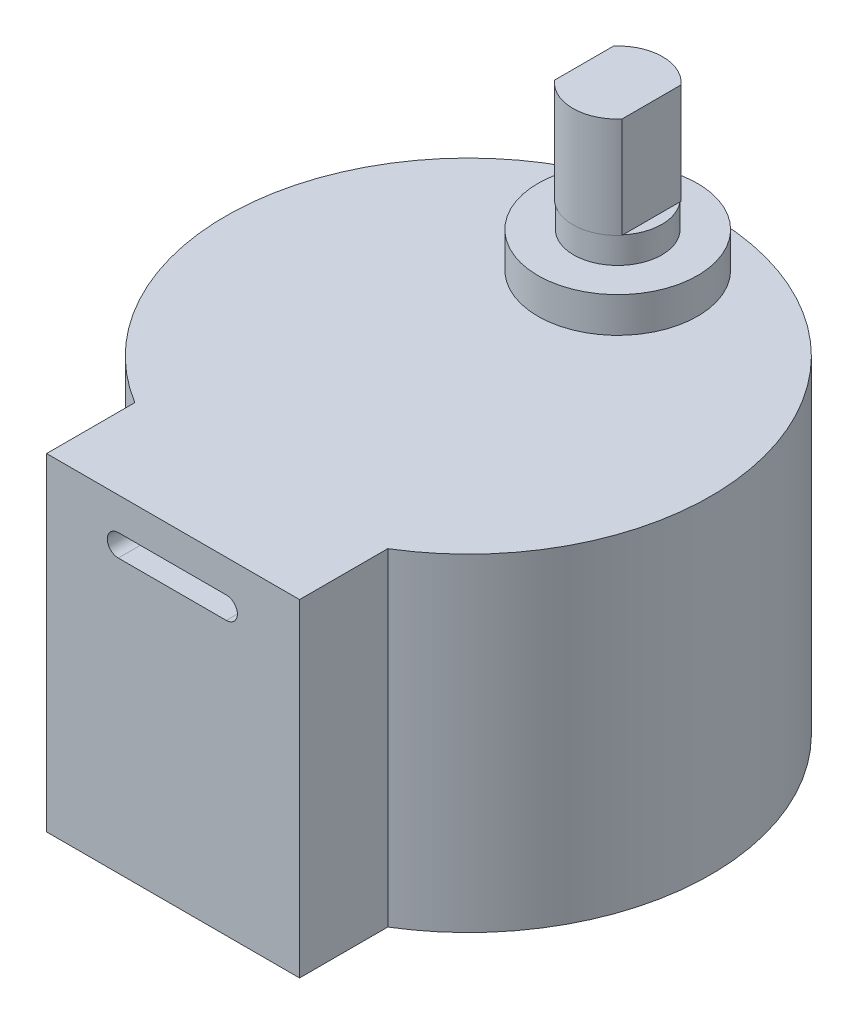
ISO-10303-21;
HEADER;
FILE_DESCRIPTION(('STEP AP214'),'2;1');
FILE_NAME('part.step','',(''),(''),'','','');
FILE_SCHEMA(('AUTOMOTIVE_DESIGN { 1 0 10303 214 1 1 1 1 }'));
ENDSEC;
DATA;
#1=APPLICATION_CONTEXT('core data for automotive mechanical design processes');
#2=APPLICATION_PROTOCOL_DEFINITION('international standard','automotive_design',2000,#1);
#3=PRODUCT_CONTEXT('',#1,'mechanical');
#4=PRODUCT('Part','Part','',(#3));
#5=PRODUCT_RELATED_PRODUCT_CATEGORY('part','',(#4));
#6=PRODUCT_DEFINITION_FORMATION('','',#4);
#7=PRODUCT_DEFINITION_CONTEXT('part definition',#1,'design');
#8=PRODUCT_DEFINITION('design','',#6,#7);
#9=PRODUCT_DEFINITION_SHAPE('','',#8);
#10=(LENGTH_UNIT() NAMED_UNIT(*) SI_UNIT(.MILLI.,.METRE.));
#11=(NAMED_UNIT(*) PLANE_ANGLE_UNIT() SI_UNIT($,.RADIAN.));
#12=(NAMED_UNIT(*) SI_UNIT($,.STERADIAN.) SOLID_ANGLE_UNIT());
#13=UNCERTAINTY_MEASURE_WITH_UNIT(LENGTH_MEASURE(1.E-05),#10,'distance_accuracy_value','');
#14=(GEOMETRIC_REPRESENTATION_CONTEXT(3) GLOBAL_UNCERTAINTY_ASSIGNED_CONTEXT((#13)) GLOBAL_UNIT_ASSIGNED_CONTEXT((#10,
#11,#12)) REPRESENTATION_CONTEXT('',''));
#15=CARTESIAN_POINT('',(0.,0.,0.));
#16=DIRECTION('',(0.,0.,1.));
#17=DIRECTION('',(1.,0.,0.));
#18=AXIS2_PLACEMENT_3D('',#15,#16,#17);
#19=CARTESIAN_POINT('',(0.0190500000000031,22.4282,-8.5852336970394));
#20=DIRECTION('',(0.,1.,0.));
#21=DIRECTION('',(0.,0.,1.));
#22=AXIS2_PLACEMENT_3D('',#19,#20,#21);
#23=PLANE('',#22);
#24=DIRECTION('',(0.,0.,-1.));
#25=VECTOR('',#24,1.);
#26=CARTESIAN_POINT('',(1.95958426643663,22.4282,-10.2870336970394));
#27=LINE('',#26,#25);
#28=CARTESIAN_POINT('',(1.95958426643663,22.4282,-6.94635396966913));
#29=VERTEX_POINT('',#28);
#30=CARTESIAN_POINT('',(1.95958426643663,22.4282,-10.2241134244097));
#31=VERTEX_POINT('',#30);
#32=EDGE_CURVE('E11',#29,#31,#27,.T.);
#33=ORIENTED_EDGE('',*,*,#32,.F.);
#34=CARTESIAN_POINT('',(0.0190500000000031,22.4282,-8.5852336970394));
#35=DIRECTION('',(0.,1.,0.));
#36=DIRECTION('',(0.,0.,1.));
#37=AXIS2_PLACEMENT_3D('',#34,#35,#36);
#38=CIRCLE('',#37,2.54);
#39=EDGE_CURVE('E237',#29,#31,#38,.T.);
#40=ORIENTED_EDGE('',*,*,#39,.T.);
#41=EDGE_LOOP('',(#33,#40));
#42=FACE_BOUND('',#41,.T.);
#43=ADVANCED_FACE('F38',(#42),#23,.T.);
#44=CARTESIAN_POINT('',(0.,18.8722,0.));
#45=DIRECTION('',(0.,-1.,0.));
#46=DIRECTION('',(0.,0.,-1.));
#47=AXIS2_PLACEMENT_3D('',#44,#45,#46);
#48=CYLINDRICAL_SURFACE('',#47,13.97);
#49=CARTESIAN_POINT('',(0.,0.,0.));
#50=DIRECTION('',(0.,1.,0.));
#51=DIRECTION('',(0.,0.,1.));
#52=AXIS2_PLACEMENT_3D('',#49,#50,#51);
#53=CIRCLE('',#52,13.97);
#54=CARTESIAN_POINT('',(7.28345,0.,11.9210845185117));
#55=VERTEX_POINT('',#54);
#56=CARTESIAN_POINT('',(-7.28345,0.,11.9210845185117));
#57=VERTEX_POINT('',#56);
#58=EDGE_CURVE('E251',#55,#57,#53,.T.);
#59=ORIENTED_EDGE('',*,*,#58,.T.);
#60=DIRECTION('',(0.,-1.,0.));
#61=VECTOR('',#60,1.);
#62=CARTESIAN_POINT('',(-7.28345,18.8722,11.9210845185117));
#63=LINE('',#62,#61);
#64=CARTESIAN_POINT('',(-7.28345,18.8722,11.9210845185117));
#65=VERTEX_POINT('',#64);
#66=EDGE_CURVE('E42',#65,#57,#63,.T.);
#67=ORIENTED_EDGE('',*,*,#66,.F.);
#68=CARTESIAN_POINT('',(0.,18.8722,0.));
#69=DIRECTION('',(0.,1.,0.));
#70=DIRECTION('',(0.,0.,1.));
#71=AXIS2_PLACEMENT_3D('',#68,#69,#70);
#72=CIRCLE('',#71,13.97);
#73=CARTESIAN_POINT('',(7.28345,18.8722,11.9210845185117));
#74=VERTEX_POINT('',#73);
#75=EDGE_CURVE('E255',#74,#65,#72,.T.);
#76=ORIENTED_EDGE('',*,*,#75,.F.);
#77=DIRECTION('',(0.,-1.,0.));
#78=VECTOR('',#77,1.);
#79=CARTESIAN_POINT('',(7.28345,18.8722,11.9210845185117));
#80=LINE('',#79,#78);
#81=EDGE_CURVE('E269',#74,#55,#80,.T.);
#82=ORIENTED_EDGE('',*,*,#81,.T.);
#83=EDGE_LOOP('',(#59,#67,#76,#82));
#84=FACE_BOUND('',#83,.T.);
#85=ADVANCED_FACE('F40',(#84),#48,.T.);
#86=CARTESIAN_POINT('',(-7.28345,18.8722,11.9210845185117));
#87=DIRECTION('',(1.,0.,0.));
#88=DIRECTION('',(0.,0.,-1.));
#89=AXIS2_PLACEMENT_3D('',#86,#87,#88);
#90=PLANE('',#89);
#91=DIRECTION('',(0.,0.,1.));
#92=VECTOR('',#91,1.);
#93=CARTESIAN_POINT('',(-7.28345,0.,11.9210845185117));
#94=LINE('',#93,#92);
#95=CARTESIAN_POINT('',(-7.28345,0.,17.0010845185117));
#96=VERTEX_POINT('',#95);
#97=EDGE_CURVE('E273',#57,#96,#94,.T.);
#98=ORIENTED_EDGE('',*,*,#97,.T.);
#99=DIRECTION('',(0.,-1.,0.));
#100=VECTOR('',#99,1.);
#101=CARTESIAN_POINT('',(-7.28345,18.8722,17.0010845185117));
#102=LINE('',#101,#100);
#103=CARTESIAN_POINT('',(-7.28345,18.8722,17.0010845185117));
#104=VERTEX_POINT('',#103);
#105=EDGE_CURVE('E287',#104,#96,#102,.T.);
#106=ORIENTED_EDGE('',*,*,#105,.F.);
#107=DIRECTION('',(0.,0.,1.));
#108=VECTOR('',#107,1.);
#109=CARTESIAN_POINT('',(-7.28345,18.8722,11.9210845185117));
#110=LINE('',#109,#108);
#111=EDGE_CURVE('E259',#65,#104,#110,.T.);
#112=ORIENTED_EDGE('',*,*,#111,.F.);
#113=ORIENTED_EDGE('',*,*,#66,.T.);
#114=EDGE_LOOP('',(#98,#106,#112,#113));
#115=FACE_BOUND('',#114,.T.);
#116=ADVANCED_FACE('F346',(#115),#90,.F.);
#117=CARTESIAN_POINT('',(-7.28345,18.8722,17.0010845185117));
#118=DIRECTION('',(0.,0.,-1.));
#119=DIRECTION('',(-1.,0.,0.));
#120=AXIS2_PLACEMENT_3D('',#117,#118,#119);
#121=PLANE('',#120);
#122=DIRECTION('',(1.,0.,0.));
#123=VECTOR('',#122,1.);
#124=CARTESIAN_POINT('',(-3.15595,15.7243009045799,17.0010845185117));
#125=LINE('',#124,#123);
#126=CARTESIAN_POINT('',(-3.15595,15.7243009045799,17.0010845185117));
#127=VERTEX_POINT('',#126);
#128=CARTESIAN_POINT('',(3.06705,15.7243009045799,17.0010845185117));
#129=VERTEX_POINT('',#128);
#130=EDGE_CURVE('E179',#127,#129,#125,.T.);
#131=ORIENTED_EDGE('',*,*,#130,.F.);
#132=CARTESIAN_POINT('',(-3.15595,16.3593009045799,17.0010845185117));
#133=DIRECTION('',(0.,0.,1.));
#134=DIRECTION('',(1.,0.,0.));
#135=AXIS2_PLACEMENT_3D('',#132,#133,#134);
#136=CIRCLE('',#135,0.635);
#137=CARTESIAN_POINT('',(-3.15595,16.9943009045799,17.0010845185117));
#138=VERTEX_POINT('',#137);
#139=EDGE_CURVE('E58',#138,#127,#136,.T.);
#140=ORIENTED_EDGE('',*,*,#139,.F.);
#141=DIRECTION('',(-1.,0.,0.));
#142=VECTOR('',#141,1.);
#143=CARTESIAN_POINT('',(-3.15595,16.9943009045799,17.0010845185117));
#144=LINE('',#143,#142);
#145=CARTESIAN_POINT('',(3.06705,16.9943009045799,17.0010845185117));
#146=VERTEX_POINT('',#145);
#147=EDGE_CURVE('E166',#146,#138,#144,.T.);
#148=ORIENTED_EDGE('',*,*,#147,.F.);
#149=CARTESIAN_POINT('',(3.06705,16.3593009045799,17.0010845185117));
#150=DIRECTION('',(0.,0.,1.));
#151=DIRECTION('',(1.,0.,0.));
#152=AXIS2_PLACEMENT_3D('',#149,#150,#151);
#153=CIRCLE('',#152,0.635);
#154=EDGE_CURVE('E170',#129,#146,#153,.T.);
#155=ORIENTED_EDGE('',*,*,#154,.F.);
#156=EDGE_LOOP('',(#131,#140,#148,#155));
#157=FACE_BOUND('',#156,.T.);
#158=DIRECTION('',(1.,0.,0.));
#159=VECTOR('',#158,1.);
#160=CARTESIAN_POINT('',(-7.28345,0.,17.0010845185117));
#161=LINE('',#160,#159);
#162=CARTESIAN_POINT('',(7.28345,0.,17.0010845185117));
#163=VERTEX_POINT('',#162);
#164=EDGE_CURVE('E276',#96,#163,#161,.T.);
#165=ORIENTED_EDGE('',*,*,#164,.T.);
#166=DIRECTION('',(0.,-1.,0.));
#167=VECTOR('',#166,1.);
#168=CARTESIAN_POINT('',(7.28345,18.8722,17.0010845185117));
#169=LINE('',#168,#167);
#170=CARTESIAN_POINT('',(7.28345,18.8722,17.0010845185117));
#171=VERTEX_POINT('',#170);
#172=EDGE_CURVE('E284',#171,#163,#169,.T.);
#173=ORIENTED_EDGE('',*,*,#172,.F.);
#174=DIRECTION('',(1.,0.,0.));
#175=VECTOR('',#174,1.);
#176=CARTESIAN_POINT('',(-7.28345,18.8722,17.0010845185117));
#177=LINE('',#176,#175);
#178=EDGE_CURVE('E263',#104,#171,#177,.T.);
#179=ORIENTED_EDGE('',*,*,#178,.F.);
#180=ORIENTED_EDGE('',*,*,#105,.T.);
#181=EDGE_LOOP('',(#165,#173,#179,#180));
#182=FACE_BOUND('',#181,.T.);
#183=ADVANCED_FACE('F377',(#157,#182),#121,.F.);
#184=CARTESIAN_POINT('',(7.28345,18.8722,11.9210845185117));
#185=DIRECTION('',(-1.,0.,0.));
#186=DIRECTION('',(0.,0.,1.));
#187=AXIS2_PLACEMENT_3D('',#184,#185,#186);
#188=PLANE('',#187);
#189=DIRECTION('',(0.,0.,-1.));
#190=VECTOR('',#189,1.);
#191=CARTESIAN_POINT('',(7.28345,0.,11.9210845185117));
#192=LINE('',#191,#190);
#193=EDGE_CURVE('E260',#163,#55,#192,.T.);
#194=ORIENTED_EDGE('',*,*,#193,.T.);
#195=ORIENTED_EDGE('',*,*,#81,.F.);
#196=DIRECTION('',(0.,0.,-1.));
#197=VECTOR('',#196,1.);
#198=CARTESIAN_POINT('',(7.28345,18.8722,11.9210845185117));
#199=LINE('',#198,#197);
#200=EDGE_CURVE('E266',#171,#74,#199,.T.);
#201=ORIENTED_EDGE('',*,*,#200,.F.);
#202=ORIENTED_EDGE('',*,*,#172,.T.);
#203=EDGE_LOOP('',(#194,#195,#201,#202));
#204=FACE_BOUND('',#203,.T.);
#205=ADVANCED_FACE('F371',(#204),#188,.F.);
#206=CARTESIAN_POINT('',(0.,18.8722,0.));
#207=DIRECTION('',(0.,1.,0.));
#208=DIRECTION('',(0.,0.,1.));
#209=AXIS2_PLACEMENT_3D('',#206,#207,#208);
#210=PLANE('',#209);
#211=CARTESIAN_POINT('',(0.0190500000000031,18.8722,-8.5852336970394));
#212=DIRECTION('',(0.,1.,0.));
#213=DIRECTION('',(0.,0.,1.));
#214=AXIS2_PLACEMENT_3D('',#211,#212,#213);
#215=CIRCLE('',#214,4.5974);
#216=CARTESIAN_POINT('',(0.0190500000000031,18.8722,-3.9878336970394));
#217=VERTEX_POINT('',#216);
#218=EDGE_CURVE('E246',#217,#217,#215,.T.);
#219=ORIENTED_EDGE('',*,*,#218,.F.);
#220=EDGE_LOOP('',(#219));
#221=FACE_BOUND('',#220,.T.);
#222=ORIENTED_EDGE('',*,*,#75,.T.);
#223=ORIENTED_EDGE('',*,*,#111,.T.);
#224=ORIENTED_EDGE('',*,*,#178,.T.);
#225=ORIENTED_EDGE('',*,*,#200,.T.);
#226=EDGE_LOOP('',(#222,#223,#224,#225));
#227=FACE_BOUND('',#226,.T.);
#228=ADVANCED_FACE('F368',(#221,#227),#210,.T.);
#229=CARTESIAN_POINT('',(0.,0.,0.));
#230=DIRECTION('',(0.,1.,0.));
#231=DIRECTION('',(0.,0.,1.));
#232=AXIS2_PLACEMENT_3D('',#229,#230,#231);
#233=PLANE('',#232);
#234=ORIENTED_EDGE('',*,*,#58,.F.);
#235=ORIENTED_EDGE('',*,*,#193,.F.);
#236=ORIENTED_EDGE('',*,*,#164,.F.);
#237=ORIENTED_EDGE('',*,*,#97,.F.);
#238=EDGE_LOOP('',(#234,#235,#236,#237));
#239=FACE_BOUND('',#238,.T.);
#240=ADVANCED_FACE('F365',(#239),#233,.F.);
#241=CARTESIAN_POINT('',(0.0190500000000031,20.9042,-8.5852336970394));
#242=DIRECTION('',(0.,1.,0.));
#243=DIRECTION('',(0.,0.,1.));
#244=AXIS2_PLACEMENT_3D('',#241,#242,#243);
#245=PLANE('',#244);
#246=CARTESIAN_POINT('',(0.0190500000000031,20.9042,-8.5852336970394));
#247=DIRECTION('',(0.,1.,0.));
#248=DIRECTION('',(0.,0.,1.));
#249=AXIS2_PLACEMENT_3D('',#246,#247,#248);
#250=CIRCLE('',#249,4.5974);
#251=CARTESIAN_POINT('',(0.0190500000000031,20.9042,-3.9878336970394));
#252=VERTEX_POINT('',#251);
#253=EDGE_CURVE('E247',#252,#252,#250,.T.);
#254=ORIENTED_EDGE('',*,*,#253,.T.);
#255=EDGE_LOOP('',(#254));
#256=FACE_BOUND('',#255,.T.);
#257=CARTESIAN_POINT('',(0.0190500000000031,20.9042,-8.5852336970394));
#258=DIRECTION('',(0.,1.,0.));
#259=DIRECTION('',(0.,0.,1.));
#260=AXIS2_PLACEMENT_3D('',#257,#258,#259);
#261=CIRCLE('',#260,2.54);
#262=CARTESIAN_POINT('',(0.0190500000000031,20.9042,-6.0452336970394));
#263=VERTEX_POINT('',#262);
#264=EDGE_CURVE('E241',#263,#263,#261,.T.);
#265=ORIENTED_EDGE('',*,*,#264,.F.);
#266=EDGE_LOOP('',(#265));
#267=FACE_BOUND('',#266,.T.);
#268=ADVANCED_FACE('F361',(#256,#267),#245,.T.);
#269=CARTESIAN_POINT('',(0.0190500000000031,20.9042,-8.5852336970394));
#270=DIRECTION('',(0.,-1.,0.));
#271=DIRECTION('',(0.,0.,-1.));
#272=AXIS2_PLACEMENT_3D('',#269,#270,#271);
#273=CYLINDRICAL_SURFACE('',#272,4.5974);
#274=ORIENTED_EDGE('',*,*,#253,.F.);
#275=EDGE_LOOP('',(#274));
#276=FACE_BOUND('',#275,.T.);
#277=ORIENTED_EDGE('',*,*,#218,.T.);
#278=EDGE_LOOP('',(#277));
#279=FACE_BOUND('',#278,.T.);
#280=ADVANCED_FACE('F356',(#276,#279),#273,.T.);
#281=CARTESIAN_POINT('',(0.0190500000000031,22.4282,-8.5852336970394));
#282=DIRECTION('',(0.,-1.,0.));
#283=DIRECTION('',(0.,0.,-1.));
#284=AXIS2_PLACEMENT_3D('',#281,#282,#283);
#285=CYLINDRICAL_SURFACE('',#284,2.54);
#286=ORIENTED_EDGE('',*,*,#264,.T.);
#287=EDGE_LOOP('',(#286));
#288=FACE_BOUND('',#287,.T.);
#289=ORIENTED_EDGE('',*,*,#39,.F.);
#290=CARTESIAN_POINT('',(-1.92148426643663,22.4282,-6.94635396966913));
#291=VERTEX_POINT('',#290);
#292=EDGE_CURVE('E236',#291,#29,#38,.T.);
#293=ORIENTED_EDGE('',*,*,#292,.F.);
#294=CARTESIAN_POINT('',(-1.92148426643663,22.4282,-10.2241134244097));
#295=VERTEX_POINT('',#294);
#296=EDGE_CURVE('E332',#295,#291,#38,.T.);
#297=ORIENTED_EDGE('',*,*,#296,.F.);
#298=EDGE_CURVE('E242',#31,#295,#38,.T.);
#299=ORIENTED_EDGE('',*,*,#298,.F.);
#300=EDGE_LOOP('',(#289,#293,#297,#299));
#301=FACE_BOUND('',#300,.T.);
#302=ADVANCED_FACE('F337',(#288,#301),#285,.T.);
#303=DIRECTION('',(0.,0.,1.));
#304=VECTOR('',#303,1.);
#305=CARTESIAN_POINT('',(-1.92148426643663,22.4282,-10.2870336970394));
#306=LINE('',#305,#304);
#307=EDGE_CURVE('E48',#295,#291,#306,.T.);
#308=ORIENTED_EDGE('',*,*,#307,.F.);
#309=ORIENTED_EDGE('',*,*,#296,.T.);
#310=EDGE_LOOP('',(#308,#309));
#311=FACE_BOUND('',#310,.T.);
#312=ADVANCED_FACE('F336',(#311),#23,.T.);
#313=CARTESIAN_POINT('',(0.0190500000000031,22.4282,-8.5852336970394));
#314=DIRECTION('',(0.,1.,0.));
#315=DIRECTION('',(0.,0.,1.));
#316=AXIS2_PLACEMENT_3D('',#313,#314,#315);
#317=PLANE('',#316);
#318=CARTESIAN_POINT('',(1.95958426643663,22.4282,-10.2870336970394));
#319=VERTEX_POINT('',#318);
#320=EDGE_CURVE('E51',#31,#319,#27,.T.);
#321=ORIENTED_EDGE('',*,*,#320,.F.);
#322=ORIENTED_EDGE('',*,*,#298,.T.);
#323=CARTESIAN_POINT('',(-1.92148426643663,22.4282,-10.2870336970394));
#324=VERTEX_POINT('',#323);
#325=EDGE_CURVE('E212',#324,#295,#306,.T.);
#326=ORIENTED_EDGE('',*,*,#325,.F.);
#327=CARTESIAN_POINT('',(0.0190500000000031,22.4282,-8.5852336970394));
#328=DIRECTION('',(0.,1.,0.));
#329=DIRECTION('',(0.,0.,1.));
#330=AXIS2_PLACEMENT_3D('',#327,#328,#329);
#331=CIRCLE('',#330,2.58104561742228);
#332=EDGE_CURVE('E188',#319,#324,#331,.T.);
#333=ORIENTED_EDGE('',*,*,#332,.F.);
#334=EDGE_LOOP('',(#321,#322,#326,#333));
#335=FACE_BOUND('',#334,.T.);
#336=ADVANCED_FACE('F327',(#335),#317,.F.);
#337=CARTESIAN_POINT('',(-1.92148426643663,22.4282,-6.8834336970394));
#338=VERTEX_POINT('',#337);
#339=EDGE_CURVE('E211',#291,#338,#306,.T.);
#340=ORIENTED_EDGE('',*,*,#339,.F.);
#341=ORIENTED_EDGE('',*,*,#292,.T.);
#342=CARTESIAN_POINT('',(1.95958426643663,22.4282,-6.8834336970394));
#343=VERTEX_POINT('',#342);
#344=EDGE_CURVE('E50',#343,#29,#27,.T.);
#345=ORIENTED_EDGE('',*,*,#344,.F.);
#346=CARTESIAN_POINT('',(0.0190500000000031,22.4282,-8.5852336970394));
#347=DIRECTION('',(0.,1.,0.));
#348=DIRECTION('',(0.,0.,1.));
#349=AXIS2_PLACEMENT_3D('',#346,#347,#348);
#350=CIRCLE('',#349,2.58104561742228);
#351=EDGE_CURVE('E216',#338,#343,#350,.T.);
#352=ORIENTED_EDGE('',*,*,#351,.F.);
#353=EDGE_LOOP('',(#340,#341,#345,#352));
#354=FACE_BOUND('',#353,.T.);
#355=ADVANCED_FACE('F312',(#354),#317,.F.);
#356=CARTESIAN_POINT('',(0.0190500000000031,28.2321,-8.5852336970394));
#357=DIRECTION('',(0.,-1.,0.));
#358=DIRECTION('',(0.,0.,-1.));
#359=AXIS2_PLACEMENT_3D('',#356,#357,#358);
#360=CYLINDRICAL_SURFACE('',#359,2.58104561742228);
#361=ORIENTED_EDGE('',*,*,#332,.T.);
#362=DIRECTION('',(0.,-1.,0.));
#363=VECTOR('',#362,1.);
#364=CARTESIAN_POINT('',(-1.92148426643663,28.2321,-10.2870336970394));
#365=LINE('',#364,#363);
#366=CARTESIAN_POINT('',(-1.92148426643663,28.2321,-10.2870336970394));
#367=VERTEX_POINT('',#366);
#368=EDGE_CURVE('E232',#367,#324,#365,.T.);
#369=ORIENTED_EDGE('',*,*,#368,.F.);
#370=CARTESIAN_POINT('',(0.0190500000000031,28.2321,-8.5852336970394));
#371=DIRECTION('',(0.,1.,0.));
#372=DIRECTION('',(0.,0.,1.));
#373=AXIS2_PLACEMENT_3D('',#370,#371,#372);
#374=CIRCLE('',#373,2.58104561742228);
#375=CARTESIAN_POINT('',(1.95958426643663,28.2321,-10.2870336970394));
#376=VERTEX_POINT('',#375);
#377=EDGE_CURVE('E194',#376,#367,#374,.T.);
#378=ORIENTED_EDGE('',*,*,#377,.F.);
#379=DIRECTION('',(0.,-1.,0.));
#380=VECTOR('',#379,1.);
#381=CARTESIAN_POINT('',(1.95958426643663,28.2321,-10.2870336970394));
#382=LINE('',#381,#380);
#383=EDGE_CURVE('E207',#376,#319,#382,.T.);
#384=ORIENTED_EDGE('',*,*,#383,.T.);
#385=EDGE_LOOP('',(#361,#369,#378,#384));
#386=FACE_BOUND('',#385,.T.);
#387=ADVANCED_FACE('F324',(#386),#360,.T.);
#388=CARTESIAN_POINT('',(-1.92148426643663,28.2321,-10.2870336970394));
#389=DIRECTION('',(1.,0.,0.));
#390=DIRECTION('',(0.,0.,-1.));
#391=AXIS2_PLACEMENT_3D('',#388,#389,#390);
#392=PLANE('',#391);
#393=ORIENTED_EDGE('',*,*,#325,.T.);
#394=ORIENTED_EDGE('',*,*,#307,.T.);
#395=ORIENTED_EDGE('',*,*,#339,.T.);
#396=DIRECTION('',(0.,-1.,0.));
#397=VECTOR('',#396,1.);
#398=CARTESIAN_POINT('',(-1.92148426643663,28.2321,-6.8834336970394));
#399=LINE('',#398,#397);
#400=CARTESIAN_POINT('',(-1.92148426643663,28.2321,-6.8834336970394));
#401=VERTEX_POINT('',#400);
#402=EDGE_CURVE('E228',#401,#338,#399,.T.);
#403=ORIENTED_EDGE('',*,*,#402,.F.);
#404=DIRECTION('',(0.,0.,1.));
#405=VECTOR('',#404,1.);
#406=CARTESIAN_POINT('',(-1.92148426643663,28.2321,-10.2870336970394));
#407=LINE('',#406,#405);
#408=EDGE_CURVE('E198',#367,#401,#407,.T.);
#409=ORIENTED_EDGE('',*,*,#408,.F.);
#410=ORIENTED_EDGE('',*,*,#368,.T.);
#411=EDGE_LOOP('',(#393,#394,#395,#403,#409,#410));
#412=FACE_BOUND('',#411,.T.);
#413=ADVANCED_FACE('F303',(#412),#392,.F.);
#414=CARTESIAN_POINT('',(0.0190500000000031,28.2321,-8.5852336970394));
#415=DIRECTION('',(0.,-1.,0.));
#416=DIRECTION('',(0.,0.,-1.));
#417=AXIS2_PLACEMENT_3D('',#414,#415,#416);
#418=CYLINDRICAL_SURFACE('',#417,2.58104561742228);
#419=ORIENTED_EDGE('',*,*,#351,.T.);
#420=DIRECTION('',(0.,-1.,0.));
#421=VECTOR('',#420,1.);
#422=CARTESIAN_POINT('',(1.95958426643663,28.2321,-6.8834336970394));
#423=LINE('',#422,#421);
#424=CARTESIAN_POINT('',(1.95958426643663,28.2321,-6.8834336970394));
#425=VERTEX_POINT('',#424);
#426=EDGE_CURVE('E224',#425,#343,#423,.T.);
#427=ORIENTED_EDGE('',*,*,#426,.F.);
#428=CARTESIAN_POINT('',(0.0190500000000031,28.2321,-8.5852336970394));
#429=DIRECTION('',(0.,1.,0.));
#430=DIRECTION('',(0.,0.,1.));
#431=AXIS2_PLACEMENT_3D('',#428,#429,#430);
#432=CIRCLE('',#431,2.58104561742228);
#433=EDGE_CURVE('E201',#401,#425,#432,.T.);
#434=ORIENTED_EDGE('',*,*,#433,.F.);
#435=ORIENTED_EDGE('',*,*,#402,.T.);
#436=EDGE_LOOP('',(#419,#427,#434,#435));
#437=FACE_BOUND('',#436,.T.);
#438=ADVANCED_FACE('F309',(#437),#418,.T.);
#439=CARTESIAN_POINT('',(1.95958426643663,28.2321,-10.2870336970394));
#440=DIRECTION('',(-1.,0.,0.));
#441=DIRECTION('',(0.,0.,1.));
#442=AXIS2_PLACEMENT_3D('',#439,#440,#441);
#443=PLANE('',#442);
#444=ORIENTED_EDGE('',*,*,#344,.T.);
#445=ORIENTED_EDGE('',*,*,#32,.T.);
#446=ORIENTED_EDGE('',*,*,#320,.T.);
#447=ORIENTED_EDGE('',*,*,#383,.F.);
#448=DIRECTION('',(0.,0.,-1.));
#449=VECTOR('',#448,1.);
#450=CARTESIAN_POINT('',(1.95958426643663,28.2321,-10.2870336970394));
#451=LINE('',#450,#449);
#452=EDGE_CURVE('E204',#425,#376,#451,.T.);
#453=ORIENTED_EDGE('',*,*,#452,.F.);
#454=ORIENTED_EDGE('',*,*,#426,.T.);
#455=EDGE_LOOP('',(#444,#445,#446,#447,#453,#454));
#456=FACE_BOUND('',#455,.T.);
#457=ADVANCED_FACE('F315',(#456),#443,.F.);
#458=CARTESIAN_POINT('',(0.0190500000000031,28.2321,-8.5852336970394));
#459=DIRECTION('',(0.,1.,0.));
#460=DIRECTION('',(0.,0.,1.));
#461=AXIS2_PLACEMENT_3D('',#458,#459,#460);
#462=PLANE('',#461);
#463=ORIENTED_EDGE('',*,*,#377,.T.);
#464=ORIENTED_EDGE('',*,*,#408,.T.);
#465=ORIENTED_EDGE('',*,*,#433,.T.);
#466=ORIENTED_EDGE('',*,*,#452,.T.);
#467=EDGE_LOOP('',(#463,#464,#465,#466));
#468=FACE_BOUND('',#467,.T.);
#469=ADVANCED_FACE('F320',(#468),#462,.T.);
#470=CARTESIAN_POINT('',(-3.15595,16.3593009045799,9.38108451851173));
#471=DIRECTION('',(0.,0.,1.));
#472=DIRECTION('',(1.,0.,0.));
#473=AXIS2_PLACEMENT_3D('',#470,#471,#472);
#474=CYLINDRICAL_SURFACE('',#473,0.635);
#475=ORIENTED_EDGE('',*,*,#139,.T.);
#476=DIRECTION('',(0.,0.,1.));
#477=VECTOR('',#476,1.);
#478=CARTESIAN_POINT('',(-3.15595,15.7243009045799,9.38108451851173));
#479=LINE('',#478,#477);
#480=CARTESIAN_POINT('',(-3.15595,15.7243009045799,9.38108451851173));
#481=VERTEX_POINT('',#480);
#482=EDGE_CURVE('E141',#481,#127,#479,.T.);
#483=ORIENTED_EDGE('',*,*,#482,.F.);
#484=CARTESIAN_POINT('',(-3.15595,16.3593009045799,9.38108451851173));
#485=DIRECTION('',(0.,0.,1.));
#486=DIRECTION('',(1.,0.,0.));
#487=AXIS2_PLACEMENT_3D('',#484,#485,#486);
#488=CIRCLE('',#487,0.635);
#489=CARTESIAN_POINT('',(-3.15595,16.9943009045799,9.38108451851173));
#490=VERTEX_POINT('',#489);
#491=EDGE_CURVE('E145',#490,#481,#488,.T.);
#492=ORIENTED_EDGE('',*,*,#491,.F.);
#493=DIRECTION('',(0.,0.,1.));
#494=VECTOR('',#493,1.);
#495=CARTESIAN_POINT('',(-3.15595,16.9943009045799,9.38108451851173));
#496=LINE('',#495,#494);
#497=EDGE_CURVE('E185',#490,#138,#496,.T.);
#498=ORIENTED_EDGE('',*,*,#497,.T.);
#499=EDGE_LOOP('',(#475,#483,#492,#498));
#500=FACE_BOUND('',#499,.T.);
#501=ADVANCED_FACE('F143',(#500),#474,.F.);
#502=CARTESIAN_POINT('',(-3.15595,16.9943009045799,9.38108451851173));
#503=DIRECTION('',(0.,1.,0.));
#504=DIRECTION('',(0.,0.,1.));
#505=AXIS2_PLACEMENT_3D('',#502,#503,#504);
#506=PLANE('',#505);
#507=ORIENTED_EDGE('',*,*,#147,.T.);
#508=ORIENTED_EDGE('',*,*,#497,.F.);
#509=DIRECTION('',(-1.,0.,0.));
#510=VECTOR('',#509,1.);
#511=CARTESIAN_POINT('',(-3.15595,16.9943009045799,9.38108451851173));
#512=LINE('',#511,#510);
#513=CARTESIAN_POINT('',(3.06705,16.9943009045799,9.38108451851173));
#514=VERTEX_POINT('',#513);
#515=EDGE_CURVE('E152',#514,#490,#512,.T.);
#516=ORIENTED_EDGE('',*,*,#515,.F.);
#517=DIRECTION('',(0.,0.,1.));
#518=VECTOR('',#517,1.);
#519=CARTESIAN_POINT('',(3.06705,16.9943009045799,9.38108451851173));
#520=LINE('',#519,#518);
#521=EDGE_CURVE('E189',#514,#146,#520,.T.);
#522=ORIENTED_EDGE('',*,*,#521,.T.);
#523=EDGE_LOOP('',(#507,#508,#516,#522));
#524=FACE_BOUND('',#523,.T.);
#525=ADVANCED_FACE('F490',(#524),#506,.F.);
#526=CARTESIAN_POINT('',(3.06705,16.3593009045799,9.38108451851173));
#527=DIRECTION('',(0.,0.,1.));
#528=DIRECTION('',(1.,0.,0.));
#529=AXIS2_PLACEMENT_3D('',#526,#527,#528);
#530=CYLINDRICAL_SURFACE('',#529,0.635);
#531=ORIENTED_EDGE('',*,*,#154,.T.);
#532=ORIENTED_EDGE('',*,*,#521,.F.);
#533=CARTESIAN_POINT('',(3.06705,16.3593009045799,9.38108451851173));
#534=DIRECTION('',(0.,0.,1.));
#535=DIRECTION('',(1.,0.,0.));
#536=AXIS2_PLACEMENT_3D('',#533,#534,#535);
#537=CIRCLE('',#536,0.635);
#538=CARTESIAN_POINT('',(3.06705,15.7243009045799,9.38108451851173));
#539=VERTEX_POINT('',#538);
#540=EDGE_CURVE('E161',#539,#514,#537,.T.);
#541=ORIENTED_EDGE('',*,*,#540,.F.);
#542=DIRECTION('',(0.,0.,1.));
#543=VECTOR('',#542,1.);
#544=CARTESIAN_POINT('',(3.06705,15.7243009045799,9.38108451851173));
#545=LINE('',#544,#543);
#546=EDGE_CURVE('E151',#539,#129,#545,.T.);
#547=ORIENTED_EDGE('',*,*,#546,.T.);
#548=EDGE_LOOP('',(#531,#532,#541,#547));
#549=FACE_BOUND('',#548,.T.);
#550=ADVANCED_FACE('F498',(#549),#530,.F.);
#551=CARTESIAN_POINT('',(-3.15595,15.7243009045799,9.38108451851173));
#552=DIRECTION('',(0.,-1.,0.));
#553=DIRECTION('',(0.,0.,-1.));
#554=AXIS2_PLACEMENT_3D('',#551,#552,#553);
#555=PLANE('',#554);
#556=ORIENTED_EDGE('',*,*,#130,.T.);
#557=ORIENTED_EDGE('',*,*,#546,.F.);
#558=DIRECTION('',(1.,0.,0.));
#559=VECTOR('',#558,1.);
#560=CARTESIAN_POINT('',(-3.15595,15.7243009045799,9.38108451851173));
#561=LINE('',#560,#559);
#562=EDGE_CURVE('E155',#481,#539,#561,.T.);
#563=ORIENTED_EDGE('',*,*,#562,.F.);
#564=ORIENTED_EDGE('',*,*,#482,.T.);
#565=EDGE_LOOP('',(#556,#557,#563,#564));
#566=FACE_BOUND('',#565,.T.);
#567=ADVANCED_FACE('F156',(#566),#555,.F.);
#568=CARTESIAN_POINT('',(-3.15595,16.3593009045799,9.38108451851173));
#569=DIRECTION('',(0.,0.,1.));
#570=DIRECTION('',(1.,0.,0.));
#571=AXIS2_PLACEMENT_3D('',#568,#569,#570);
#572=PLANE('',#571);
#573=ORIENTED_EDGE('',*,*,#491,.T.);
#574=ORIENTED_EDGE('',*,*,#562,.T.);
#575=ORIENTED_EDGE('',*,*,#540,.T.);
#576=ORIENTED_EDGE('',*,*,#515,.T.);
#577=EDGE_LOOP('',(#573,#574,#575,#576));
#578=FACE_BOUND('',#577,.T.);
#579=ADVANCED_FACE('F163',(#578),#572,.T.);
#580=CLOSED_SHELL('',(#43,#85,#116,#183,#205,#228,#240,#268,#280,#302,#312,#336,#355,#387,#413,
#438,#457,#469,#501,#525,#550,#567,#579));
#581=MANIFOLD_SOLID_BREP('B2',#580);
#582=ADVANCED_BREP_SHAPE_REPRESENTATION('',(#18,#581),#14);
#583=SHAPE_DEFINITION_REPRESENTATION(#9,#582);
ENDSEC;
END-ISO-10303-21;
